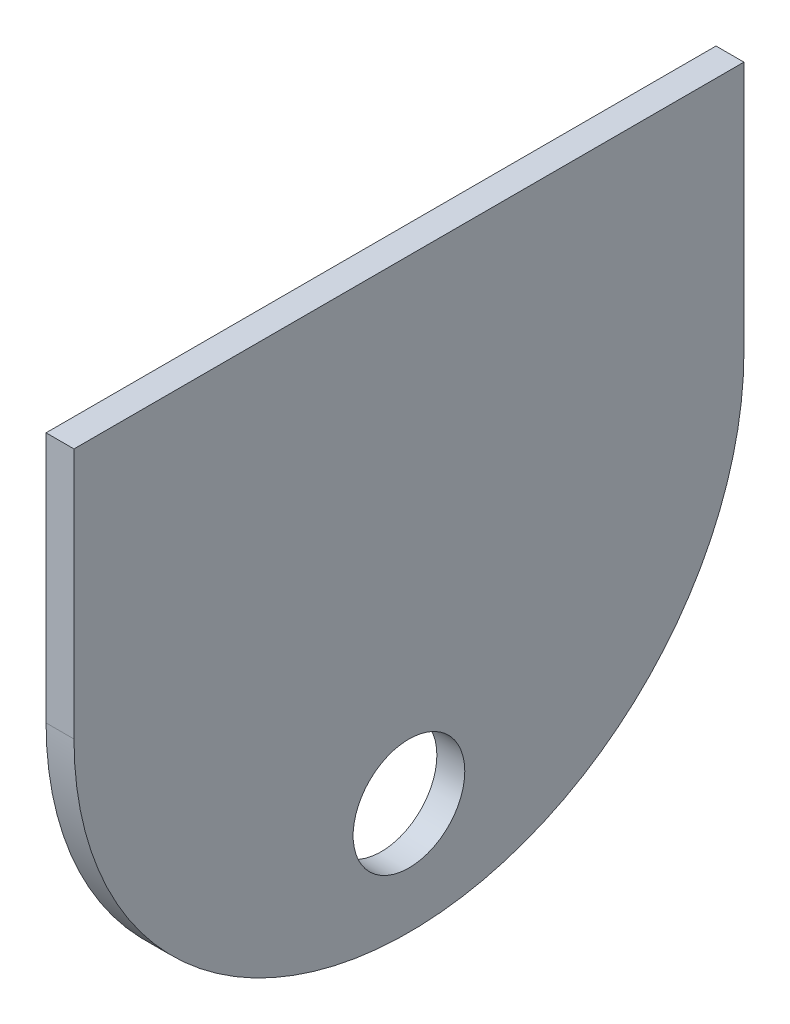
ISO-10303-21;
HEADER;
FILE_DESCRIPTION(('STEP AP214'),'2;1');
FILE_NAME('part.step','',(''),(''),'','','');
FILE_SCHEMA(('AUTOMOTIVE_DESIGN { 1 0 10303 214 1 1 1 1 }'));
ENDSEC;
DATA;
#1=APPLICATION_CONTEXT('core data for automotive mechanical design processes');
#2=APPLICATION_PROTOCOL_DEFINITION('international standard','automotive_design',2000,#1);
#3=PRODUCT_CONTEXT('',#1,'mechanical');
#4=PRODUCT('Part','Part','',(#3));
#5=PRODUCT_RELATED_PRODUCT_CATEGORY('part','',(#4));
#6=PRODUCT_DEFINITION_FORMATION('','',#4);
#7=PRODUCT_DEFINITION_CONTEXT('part definition',#1,'design');
#8=PRODUCT_DEFINITION('design','',#6,#7);
#9=PRODUCT_DEFINITION_SHAPE('','',#8);
#10=(LENGTH_UNIT() NAMED_UNIT(*) SI_UNIT(.MILLI.,.METRE.));
#11=(NAMED_UNIT(*) PLANE_ANGLE_UNIT() SI_UNIT($,.RADIAN.));
#12=(NAMED_UNIT(*) SI_UNIT($,.STERADIAN.) SOLID_ANGLE_UNIT());
#13=UNCERTAINTY_MEASURE_WITH_UNIT(LENGTH_MEASURE(1.E-05),#10,'distance_accuracy_value','');
#14=(GEOMETRIC_REPRESENTATION_CONTEXT(3) GLOBAL_UNCERTAINTY_ASSIGNED_CONTEXT((#13)) GLOBAL_UNIT_ASSIGNED_CONTEXT((#10,
#11,#12)) REPRESENTATION_CONTEXT('',''));
#15=CARTESIAN_POINT('',(0.,0.,0.));
#16=DIRECTION('',(0.,0.,1.));
#17=DIRECTION('',(1.,0.,0.));
#18=AXIS2_PLACEMENT_3D('',#15,#16,#17);
#19=CARTESIAN_POINT('',(3.175,0.,0.));
#20=DIRECTION('',(-1.,0.,0.));
#21=DIRECTION('',(0.,0.,1.));
#22=AXIS2_PLACEMENT_3D('',#19,#20,#21);
#23=CYLINDRICAL_SURFACE('',#22,38.1);
#24=CARTESIAN_POINT('',(0.,0.,0.));
#25=DIRECTION('',(1.,0.,0.));
#26=DIRECTION('',(0.,0.,-1.));
#27=AXIS2_PLACEMENT_3D('',#24,#25,#26);
#28=CIRCLE('',#27,38.1);
#29=CARTESIAN_POINT('',(0.,0.,38.1));
#30=VERTEX_POINT('',#29);
#31=CARTESIAN_POINT('',(0.,0.,-38.1));
#32=VERTEX_POINT('',#31);
#33=EDGE_CURVE('E110',#30,#32,#28,.T.);
#34=ORIENTED_EDGE('',*,*,#33,.T.);
#35=DIRECTION('',(-1.,0.,0.));
#36=VECTOR('',#35,1.);
#37=CARTESIAN_POINT('',(3.175,0.,-38.1));
#38=LINE('',#37,#36);
#39=CARTESIAN_POINT('',(3.175,0.,-38.1));
#40=VERTEX_POINT('',#39);
#41=EDGE_CURVE('E11',#40,#32,#38,.T.);
#42=ORIENTED_EDGE('',*,*,#41,.F.);
#43=CARTESIAN_POINT('',(3.175,0.,0.));
#44=DIRECTION('',(1.,0.,0.));
#45=DIRECTION('',(0.,0.,-1.));
#46=AXIS2_PLACEMENT_3D('',#43,#44,#45);
#47=CIRCLE('',#46,38.1);
#48=CARTESIAN_POINT('',(3.175,0.,38.1));
#49=VERTEX_POINT('',#48);
#50=EDGE_CURVE('E94',#49,#40,#47,.T.);
#51=ORIENTED_EDGE('',*,*,#50,.F.);
#52=DIRECTION('',(-1.,0.,0.));
#53=VECTOR('',#52,1.);
#54=CARTESIAN_POINT('',(3.175,0.,38.1));
#55=LINE('',#54,#53);
#56=EDGE_CURVE('E106',#49,#30,#55,.T.);
#57=ORIENTED_EDGE('',*,*,#56,.T.);
#58=EDGE_LOOP('',(#34,#42,#51,#57));
#59=FACE_BOUND('',#58,.T.);
#60=ADVANCED_FACE('F42',(#59),#23,.T.);
#61=CARTESIAN_POINT('',(3.175,28.575,-38.1));
#62=DIRECTION('',(0.,0.,1.));
#63=DIRECTION('',(1.,0.,0.));
#64=AXIS2_PLACEMENT_3D('',#61,#62,#63);
#65=PLANE('',#64);
#66=DIRECTION('',(0.,1.,0.));
#67=VECTOR('',#66,1.);
#68=CARTESIAN_POINT('',(0.,28.575,-38.1));
#69=LINE('',#68,#67);
#70=CARTESIAN_POINT('',(0.,28.575,-38.1));
#71=VERTEX_POINT('',#70);
#72=EDGE_CURVE('E99',#32,#71,#69,.T.);
#73=ORIENTED_EDGE('',*,*,#72,.T.);
#74=DIRECTION('',(-1.,0.,0.));
#75=VECTOR('',#74,1.);
#76=CARTESIAN_POINT('',(3.175,28.575,-38.1));
#77=LINE('',#76,#75);
#78=CARTESIAN_POINT('',(3.175,28.575,-38.1));
#79=VERTEX_POINT('',#78);
#80=EDGE_CURVE('E51',#79,#71,#77,.T.);
#81=ORIENTED_EDGE('',*,*,#80,.F.);
#82=DIRECTION('',(0.,1.,0.));
#83=VECTOR('',#82,1.);
#84=CARTESIAN_POINT('',(3.175,28.575,-38.1));
#85=LINE('',#84,#83);
#86=EDGE_CURVE('E89',#40,#79,#85,.T.);
#87=ORIENTED_EDGE('',*,*,#86,.F.);
#88=ORIENTED_EDGE('',*,*,#41,.T.);
#89=EDGE_LOOP('',(#73,#81,#87,#88));
#90=FACE_BOUND('',#89,.T.);
#91=ADVANCED_FACE('F98',(#90),#65,.F.);
#92=CARTESIAN_POINT('',(3.175,28.575,38.1));
#93=DIRECTION('',(0.,-1.,0.));
#94=DIRECTION('',(0.,0.,-1.));
#95=AXIS2_PLACEMENT_3D('',#92,#93,#94);
#96=PLANE('',#95);
#97=DIRECTION('',(0.,0.,1.));
#98=VECTOR('',#97,1.);
#99=CARTESIAN_POINT('',(0.,28.575,38.1));
#100=LINE('',#99,#98);
#101=CARTESIAN_POINT('',(0.,28.575,38.1));
#102=VERTEX_POINT('',#101);
#103=EDGE_CURVE('E76',#71,#102,#100,.T.);
#104=ORIENTED_EDGE('',*,*,#103,.T.);
#105=DIRECTION('',(-1.,0.,0.));
#106=VECTOR('',#105,1.);
#107=CARTESIAN_POINT('',(3.175,28.575,38.1));
#108=LINE('',#107,#106);
#109=CARTESIAN_POINT('',(3.175,28.575,38.1));
#110=VERTEX_POINT('',#109);
#111=EDGE_CURVE('E101',#110,#102,#108,.T.);
#112=ORIENTED_EDGE('',*,*,#111,.F.);
#113=DIRECTION('',(0.,0.,1.));
#114=VECTOR('',#113,1.);
#115=CARTESIAN_POINT('',(3.175,28.575,38.1));
#116=LINE('',#115,#114);
#117=EDGE_CURVE('E92',#79,#110,#116,.T.);
#118=ORIENTED_EDGE('',*,*,#117,.F.);
#119=ORIENTED_EDGE('',*,*,#80,.T.);
#120=EDGE_LOOP('',(#104,#112,#118,#119));
#121=FACE_BOUND('',#120,.T.);
#122=ADVANCED_FACE('F102',(#121),#96,.F.);
#123=CARTESIAN_POINT('',(3.175,0.,38.1));
#124=DIRECTION('',(0.,0.,-1.));
#125=DIRECTION('',(-1.,0.,0.));
#126=AXIS2_PLACEMENT_3D('',#123,#124,#125);
#127=PLANE('',#126);
#128=DIRECTION('',(0.,-1.,0.));
#129=VECTOR('',#128,1.);
#130=CARTESIAN_POINT('',(0.,0.,38.1));
#131=LINE('',#130,#129);
#132=EDGE_CURVE('E82',#102,#30,#131,.T.);
#133=ORIENTED_EDGE('',*,*,#132,.T.);
#134=ORIENTED_EDGE('',*,*,#56,.F.);
#135=DIRECTION('',(0.,-1.,0.));
#136=VECTOR('',#135,1.);
#137=CARTESIAN_POINT('',(3.175,0.,38.1));
#138=LINE('',#137,#136);
#139=EDGE_CURVE('E59',#110,#49,#138,.T.);
#140=ORIENTED_EDGE('',*,*,#139,.F.);
#141=ORIENTED_EDGE('',*,*,#111,.T.);
#142=EDGE_LOOP('',(#133,#134,#140,#141));
#143=FACE_BOUND('',#142,.T.);
#144=ADVANCED_FACE('F124',(#143),#127,.F.);
#145=CARTESIAN_POINT('',(3.175,0.,0.));
#146=DIRECTION('',(1.,0.,0.));
#147=DIRECTION('',(0.,0.,-1.));
#148=AXIS2_PLACEMENT_3D('',#145,#146,#147);
#149=PLANE('',#148);
#150=CARTESIAN_POINT('',(3.175,-25.4,0.));
#151=DIRECTION('',(1.,0.,0.));
#152=DIRECTION('',(0.,0.,-1.));
#153=AXIS2_PLACEMENT_3D('',#150,#151,#152);
#154=CIRCLE('',#153,6.35);
#155=CARTESIAN_POINT('',(3.175,-25.4,-6.35));
#156=VERTEX_POINT('',#155);
#157=EDGE_CURVE('E131',#156,#156,#154,.T.);
#158=ORIENTED_EDGE('',*,*,#157,.F.);
#159=EDGE_LOOP('',(#158));
#160=FACE_BOUND('',#159,.T.);
#161=ORIENTED_EDGE('',*,*,#50,.T.);
#162=ORIENTED_EDGE('',*,*,#86,.T.);
#163=ORIENTED_EDGE('',*,*,#117,.T.);
#164=ORIENTED_EDGE('',*,*,#139,.T.);
#165=EDGE_LOOP('',(#161,#162,#163,#164));
#166=FACE_BOUND('',#165,.T.);
#167=ADVANCED_FACE('F90',(#160,#166),#149,.T.);
#168=CARTESIAN_POINT('',(0.,0.,0.));
#169=DIRECTION('',(1.,0.,0.));
#170=DIRECTION('',(0.,0.,-1.));
#171=AXIS2_PLACEMENT_3D('',#168,#169,#170);
#172=PLANE('',#171);
#173=CARTESIAN_POINT('',(0.,-25.4,0.));
#174=DIRECTION('',(1.,0.,0.));
#175=DIRECTION('',(0.,0.,-1.));
#176=AXIS2_PLACEMENT_3D('',#173,#174,#175);
#177=CIRCLE('',#176,6.35);
#178=CARTESIAN_POINT('',(0.,-25.4,-6.35));
#179=VERTEX_POINT('',#178);
#180=EDGE_CURVE('E114',#179,#179,#177,.T.);
#181=ORIENTED_EDGE('',*,*,#180,.T.);
#182=EDGE_LOOP('',(#181));
#183=FACE_BOUND('',#182,.T.);
#184=ORIENTED_EDGE('',*,*,#33,.F.);
#185=ORIENTED_EDGE('',*,*,#132,.F.);
#186=ORIENTED_EDGE('',*,*,#103,.F.);
#187=ORIENTED_EDGE('',*,*,#72,.F.);
#188=EDGE_LOOP('',(#184,#185,#186,#187));
#189=FACE_BOUND('',#188,.T.);
#190=ADVANCED_FACE('F127',(#183,#189),#172,.F.);
#191=CARTESIAN_POINT('',(0.,-25.4,0.));
#192=DIRECTION('',(1.,0.,0.));
#193=DIRECTION('',(0.,0.,-1.));
#194=AXIS2_PLACEMENT_3D('',#191,#192,#193);
#195=CYLINDRICAL_SURFACE('',#194,6.35);
#196=ORIENTED_EDGE('',*,*,#180,.F.);
#197=EDGE_LOOP('',(#196));
#198=FACE_BOUND('',#197,.T.);
#199=ORIENTED_EDGE('',*,*,#157,.T.);
#200=EDGE_LOOP('',(#199));
#201=FACE_BOUND('',#200,.T.);
#202=ADVANCED_FACE('F140',(#198,#201),#195,.F.);
#203=CLOSED_SHELL('',(#60,#91,#122,#144,#167,#190,#202));
#204=MANIFOLD_SOLID_BREP('B2',#203);
#205=ADVANCED_BREP_SHAPE_REPRESENTATION('',(#18,#204),#14);
#206=SHAPE_DEFINITION_REPRESENTATION(#9,#205);
ENDSEC;
END-ISO-10303-21;
